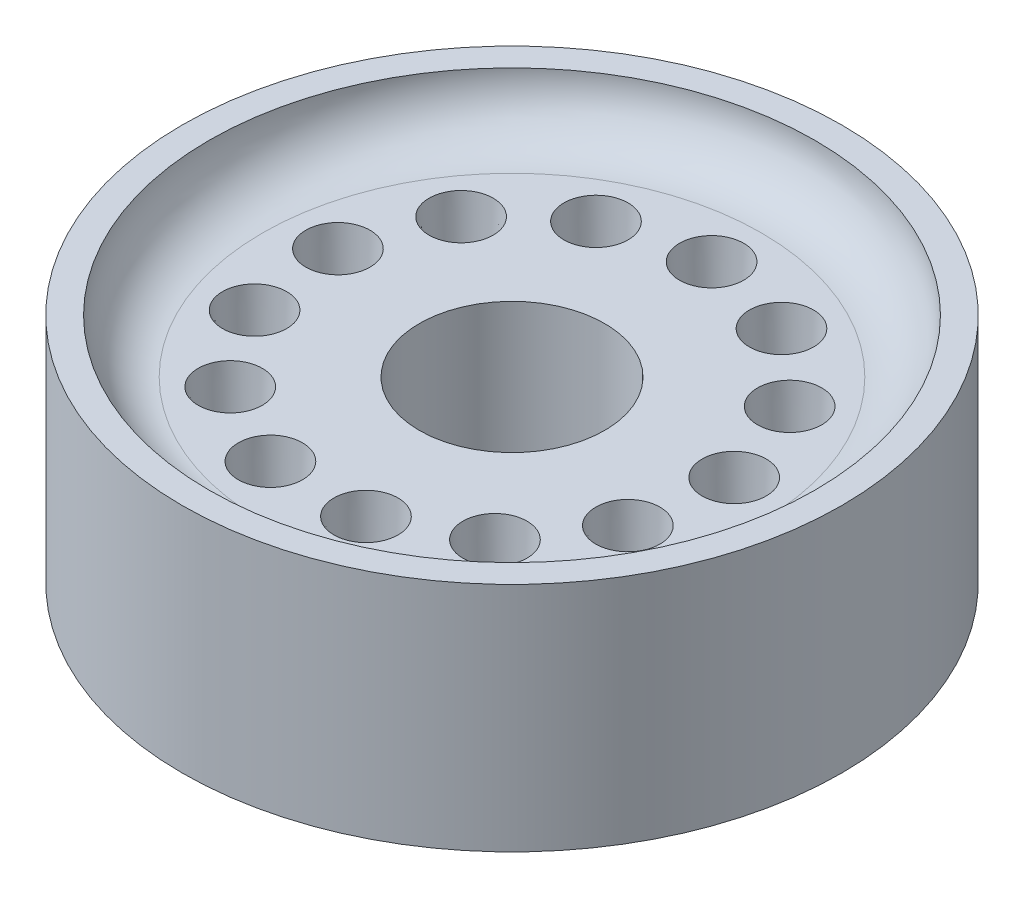
ISO-10303-21;
HEADER;
FILE_DESCRIPTION(('STEP AP214'),'2;1');
FILE_NAME('part.step','',(''),(''),'','','');
FILE_SCHEMA(('AUTOMOTIVE_DESIGN { 1 0 10303 214 1 1 1 1 }'));
ENDSEC;
DATA;
#1=APPLICATION_CONTEXT('core data for automotive mechanical design processes');
#2=APPLICATION_PROTOCOL_DEFINITION('international standard','automotive_design',2000,#1);
#3=PRODUCT_CONTEXT('',#1,'mechanical');
#4=PRODUCT('Part','Part','',(#3));
#5=PRODUCT_RELATED_PRODUCT_CATEGORY('part','',(#4));
#6=PRODUCT_DEFINITION_FORMATION('','',#4);
#7=PRODUCT_DEFINITION_CONTEXT('part definition',#1,'design');
#8=PRODUCT_DEFINITION('design','',#6,#7);
#9=PRODUCT_DEFINITION_SHAPE('','',#8);
#10=(LENGTH_UNIT() NAMED_UNIT(*) SI_UNIT(.MILLI.,.METRE.));
#11=(NAMED_UNIT(*) PLANE_ANGLE_UNIT() SI_UNIT($,.RADIAN.));
#12=(NAMED_UNIT(*) SI_UNIT($,.STERADIAN.) SOLID_ANGLE_UNIT());
#13=UNCERTAINTY_MEASURE_WITH_UNIT(LENGTH_MEASURE(1.E-05),#10,'distance_accuracy_value','');
#14=(GEOMETRIC_REPRESENTATION_CONTEXT(3) GLOBAL_UNCERTAINTY_ASSIGNED_CONTEXT((#13)) GLOBAL_UNIT_ASSIGNED_CONTEXT((#10,
#11,#12)) REPRESENTATION_CONTEXT('',''));
#15=CARTESIAN_POINT('',(0.,0.,0.));
#16=DIRECTION('',(0.,0.,1.));
#17=DIRECTION('',(1.,0.,0.));
#18=AXIS2_PLACEMENT_3D('',#15,#16,#17);
#19=CARTESIAN_POINT('',(0.,0.,0.));
#20=DIRECTION('',(0.,1.,0.));
#21=DIRECTION('',(0.,0.,1.));
#22=AXIS2_PLACEMENT_3D('',#19,#20,#21);
#23=CYLINDRICAL_SURFACE('',#22,2.6);
#24=CARTESIAN_POINT('',(0.,0.,0.));
#25=DIRECTION('',(0.,1.,0.));
#26=DIRECTION('',(0.,0.,1.));
#27=AXIS2_PLACEMENT_3D('',#24,#25,#26);
#28=CIRCLE('',#27,2.6);
#29=CARTESIAN_POINT('',(0.,0.,2.6));
#30=VERTEX_POINT('',#29);
#31=EDGE_CURVE('E48',#30,#30,#28,.T.);
#32=CARTESIAN_POINT('',(0.,5.,0.));
#33=DIRECTION('',(0.,1.,0.));
#34=DIRECTION('',(0.,0.,1.));
#35=AXIS2_PLACEMENT_3D('',#32,#33,#34);
#36=CIRCLE('',#35,2.6);
#37=CARTESIAN_POINT('',(0.,5.,2.6));
#38=VERTEX_POINT('',#37);
#39=EDGE_CURVE('E52',#38,#38,#36,.F.);
#40=CARTESIAN_POINT('',(0.,0.,2.6));
#41=CARTESIAN_POINT('',(0.,0.0520833333333332,2.6));
#42=CARTESIAN_POINT('',(0.,0.104166666666667,2.6));
#43=CARTESIAN_POINT('',(0.,0.208333333333333,2.6));
#44=CARTESIAN_POINT('',(0.,0.260416666666667,2.6));
#45=CARTESIAN_POINT('',(0.,0.364583333333333,2.6));
#46=CARTESIAN_POINT('',(0.,0.416666666666667,2.6));
#47=CARTESIAN_POINT('',(0.,0.520833333333333,2.6));
#48=CARTESIAN_POINT('',(0.,0.572916666666666,2.6));
#49=CARTESIAN_POINT('',(0.,0.677083333333333,2.6));
#50=CARTESIAN_POINT('',(0.,0.729166666666666,2.6));
#51=CARTESIAN_POINT('',(0.,0.833333333333333,2.6));
#52=CARTESIAN_POINT('',(0.,0.885416666666666,2.6));
#53=CARTESIAN_POINT('',(0.,0.989583333333333,2.6));
#54=CARTESIAN_POINT('',(0.,1.04166666666667,2.6));
#55=CARTESIAN_POINT('',(0.,1.14583333333333,2.6));
#56=CARTESIAN_POINT('',(0.,1.19791666666667,2.6));
#57=CARTESIAN_POINT('',(0.,1.30208333333333,2.6));
#58=CARTESIAN_POINT('',(0.,1.35416666666667,2.6));
#59=CARTESIAN_POINT('',(0.,1.45833333333333,2.6));
#60=CARTESIAN_POINT('',(0.,1.51041666666667,2.6));
#61=CARTESIAN_POINT('',(0.,1.61458333333333,2.6));
#62=CARTESIAN_POINT('',(0.,1.66666666666667,2.6));
#63=CARTESIAN_POINT('',(0.,1.77083333333333,2.6));
#64=CARTESIAN_POINT('',(0.,1.82291666666667,2.6));
#65=CARTESIAN_POINT('',(0.,1.92708333333333,2.6));
#66=CARTESIAN_POINT('',(0.,1.97916666666667,2.6));
#67=CARTESIAN_POINT('',(0.,2.08333333333333,2.6));
#68=CARTESIAN_POINT('',(0.,2.13541666666667,2.6));
#69=CARTESIAN_POINT('',(0.,2.23958333333333,2.6));
#70=CARTESIAN_POINT('',(0.,2.29166666666667,2.6));
#71=CARTESIAN_POINT('',(0.,2.39583333333333,2.6));
#72=CARTESIAN_POINT('',(0.,2.44791666666667,2.6));
#73=CARTESIAN_POINT('',(0.,2.55208333333333,2.6));
#74=CARTESIAN_POINT('',(0.,2.60416666666667,2.6));
#75=CARTESIAN_POINT('',(0.,2.70833333333333,2.6));
#76=CARTESIAN_POINT('',(0.,2.76041666666667,2.6));
#77=CARTESIAN_POINT('',(0.,2.86458333333333,2.6));
#78=CARTESIAN_POINT('',(0.,2.91666666666667,2.6));
#79=CARTESIAN_POINT('',(0.,3.02083333333333,2.6));
#80=CARTESIAN_POINT('',(0.,3.07291666666667,2.6));
#81=CARTESIAN_POINT('',(0.,3.17708333333333,2.6));
#82=CARTESIAN_POINT('',(0.,3.22916666666667,2.6));
#83=CARTESIAN_POINT('',(0.,3.33333333333333,2.6));
#84=CARTESIAN_POINT('',(0.,3.38541666666667,2.6));
#85=CARTESIAN_POINT('',(0.,3.48958333333333,2.6));
#86=CARTESIAN_POINT('',(0.,3.54166666666667,2.6));
#87=CARTESIAN_POINT('',(0.,3.64583333333333,2.6));
#88=CARTESIAN_POINT('',(0.,3.69791666666667,2.6));
#89=CARTESIAN_POINT('',(0.,3.80208333333333,2.6));
#90=CARTESIAN_POINT('',(0.,3.85416666666667,2.6));
#91=CARTESIAN_POINT('',(0.,3.95833333333333,2.6));
#92=CARTESIAN_POINT('',(0.,4.01041666666667,2.6));
#93=CARTESIAN_POINT('',(0.,4.11458333333333,2.6));
#94=CARTESIAN_POINT('',(0.,4.16666666666667,2.6));
#95=CARTESIAN_POINT('',(0.,4.27083333333333,2.6));
#96=CARTESIAN_POINT('',(0.,4.32291666666667,2.6));
#97=CARTESIAN_POINT('',(0.,4.42708333333333,2.6));
#98=CARTESIAN_POINT('',(0.,4.47916666666667,2.6));
#99=CARTESIAN_POINT('',(0.,4.58333333333333,2.6));
#100=CARTESIAN_POINT('',(0.,4.63541666666667,2.6));
#101=CARTESIAN_POINT('',(0.,4.73958333333333,2.6));
#102=CARTESIAN_POINT('',(0.,4.79166666666666,2.6));
#103=CARTESIAN_POINT('',(0.,4.89583333333333,2.6));
#104=CARTESIAN_POINT('',(0.,4.94791666666666,2.6));
#105=CARTESIAN_POINT('',(0.,5.,2.6));
#106=B_SPLINE_CURVE_WITH_KNOTS('',3,(#40,#41,#42,#43,#44,#45,#46,#47,#48,#49,#50,#51,#52,#53,
#54,#55,#56,#57,#58,#59,#60,#61,#62,#63,#64,#65,#66,#67,#68,#69,#70,#71,#72,#73,#74,#75,#76,#77,
#78,#79,#80,#81,#82,#83,#84,#85,#86,#87,#88,#89,#90,#91,#92,#93,#94,#95,#96,#97,#98,#99,#100,
#101,#102,#103,#104,#105),.UNSPECIFIED.,.F.,.F.,(4,2,2,2,2,2,2,2,2,2,2,2,2,2,2,2,2,2,2,2,2,2,2,
2,2,2,2,2,2,2,2,2,4),(0.,0.15625,0.3125,0.46875,0.625,0.78125,0.9375,1.09375,1.25,1.40625,
1.5625,1.71875,1.875,2.03125,2.1875,2.34375,2.5,2.65625,2.8125,2.96875,3.125,3.28125,3.4375,
3.59375,3.75,3.90625,4.0625,4.21875,4.375,4.53125,4.6875,4.84375,5.),.UNSPECIFIED.);
#107=EDGE_CURVE('BSEAM32',#30,#38,#106,.T.);
#108=ORIENTED_EDGE('',*,*,#31,.F.);
#109=ORIENTED_EDGE('',*,*,#39,.F.);
#110=ORIENTED_EDGE('',*,*,#107,.T.);
#111=ORIENTED_EDGE('',*,*,#107,.F.);
#112=EDGE_LOOP('',(#108,#110,#109,#111));
#113=FACE_BOUND('',#112,.T.);
#114=ADVANCED_FACE('F32',(#113),#23,.F.);
#115=CARTESIAN_POINT('',(0.,6.5,0.));
#116=DIRECTION('',(0.,-1.,0.));
#117=DIRECTION('',(0.,0.,-1.));
#118=AXIS2_PLACEMENT_3D('',#115,#116,#117);
#119=CYLINDRICAL_SURFACE('',#118,9.25);
#120=CARTESIAN_POINT('',(0.,0.,0.));
#121=DIRECTION('',(0.,1.,0.));
#122=DIRECTION('',(0.,0.,1.));
#123=AXIS2_PLACEMENT_3D('',#120,#121,#122);
#124=CIRCLE('',#123,9.25);
#125=CARTESIAN_POINT('',(0.,0.,-9.25));
#126=VERTEX_POINT('',#125);
#127=EDGE_CURVE('E43',#126,#126,#124,.T.);
#128=CARTESIAN_POINT('',(0.,6.5,0.));
#129=DIRECTION('',(0.,-1.,0.));
#130=DIRECTION('',(0.,0.,-1.));
#131=AXIS2_PLACEMENT_3D('',#128,#129,#130);
#132=CIRCLE('',#131,9.25);
#133=CARTESIAN_POINT('',(0.,6.5,-9.25));
#134=VERTEX_POINT('',#133);
#135=EDGE_CURVE('E39',#134,#134,#132,.T.);
#136=CARTESIAN_POINT('',(0.,0.,-9.25));
#137=CARTESIAN_POINT('',(0.,0.0677083333333333,-9.25));
#138=CARTESIAN_POINT('',(0.,0.135416666666667,-9.25));
#139=CARTESIAN_POINT('',(0.,0.270833333333334,-9.25));
#140=CARTESIAN_POINT('',(0.,0.338541666666667,-9.25));
#141=CARTESIAN_POINT('',(0.,0.473958333333334,-9.25));
#142=CARTESIAN_POINT('',(0.,0.541666666666667,-9.25));
#143=CARTESIAN_POINT('',(0.,0.677083333333334,-9.25));
#144=CARTESIAN_POINT('',(0.,0.744791666666667,-9.25));
#145=CARTESIAN_POINT('',(0.,0.880208333333333,-9.25));
#146=CARTESIAN_POINT('',(0.,0.947916666666667,-9.25));
#147=CARTESIAN_POINT('',(0.,1.08333333333333,-9.25));
#148=CARTESIAN_POINT('',(0.,1.15104166666667,-9.25));
#149=CARTESIAN_POINT('',(0.,1.28645833333333,-9.25));
#150=CARTESIAN_POINT('',(0.,1.35416666666667,-9.25));
#151=CARTESIAN_POINT('',(0.,1.48958333333333,-9.25));
#152=CARTESIAN_POINT('',(0.,1.55729166666667,-9.25));
#153=CARTESIAN_POINT('',(0.,1.69270833333333,-9.25));
#154=CARTESIAN_POINT('',(0.,1.76041666666667,-9.25));
#155=CARTESIAN_POINT('',(0.,1.89583333333333,-9.25));
#156=CARTESIAN_POINT('',(0.,1.96354166666667,-9.25));
#157=CARTESIAN_POINT('',(0.,2.09895833333333,-9.25));
#158=CARTESIAN_POINT('',(0.,2.16666666666667,-9.25));
#159=CARTESIAN_POINT('',(0.,2.30208333333333,-9.25));
#160=CARTESIAN_POINT('',(0.,2.36979166666667,-9.25));
#161=CARTESIAN_POINT('',(0.,2.50520833333333,-9.25));
#162=CARTESIAN_POINT('',(0.,2.57291666666667,-9.25));
#163=CARTESIAN_POINT('',(0.,2.70833333333333,-9.25));
#164=CARTESIAN_POINT('',(0.,2.77604166666667,-9.25));
#165=CARTESIAN_POINT('',(0.,2.91145833333333,-9.25));
#166=CARTESIAN_POINT('',(0.,2.97916666666667,-9.25));
#167=CARTESIAN_POINT('',(0.,3.11458333333333,-9.25));
#168=CARTESIAN_POINT('',(0.,3.18229166666667,-9.25));
#169=CARTESIAN_POINT('',(0.,3.31770833333333,-9.25));
#170=CARTESIAN_POINT('',(0.,3.38541666666667,-9.25));
#171=CARTESIAN_POINT('',(0.,3.52083333333333,-9.25));
#172=CARTESIAN_POINT('',(0.,3.58854166666667,-9.25));
#173=CARTESIAN_POINT('',(0.,3.72395833333333,-9.25));
#174=CARTESIAN_POINT('',(0.,3.79166666666667,-9.25));
#175=CARTESIAN_POINT('',(0.,3.92708333333333,-9.25));
#176=CARTESIAN_POINT('',(0.,3.99479166666667,-9.25));
#177=CARTESIAN_POINT('',(0.,4.13020833333333,-9.25));
#178=CARTESIAN_POINT('',(0.,4.19791666666667,-9.25));
#179=CARTESIAN_POINT('',(0.,4.33333333333333,-9.25));
#180=CARTESIAN_POINT('',(0.,4.40104166666667,-9.25));
#181=CARTESIAN_POINT('',(0.,4.53645833333333,-9.25));
#182=CARTESIAN_POINT('',(0.,4.60416666666667,-9.25));
#183=CARTESIAN_POINT('',(0.,4.73958333333333,-9.25));
#184=CARTESIAN_POINT('',(0.,4.80729166666667,-9.25));
#185=CARTESIAN_POINT('',(0.,4.94270833333333,-9.25));
#186=CARTESIAN_POINT('',(0.,5.01041666666667,-9.25));
#187=CARTESIAN_POINT('',(0.,5.14583333333333,-9.25));
#188=CARTESIAN_POINT('',(0.,5.21354166666667,-9.25));
#189=CARTESIAN_POINT('',(0.,5.34895833333333,-9.25));
#190=CARTESIAN_POINT('',(0.,5.41666666666667,-9.25));
#191=CARTESIAN_POINT('',(0.,5.55208333333333,-9.25));
#192=CARTESIAN_POINT('',(0.,5.61979166666667,-9.25));
#193=CARTESIAN_POINT('',(0.,5.75520833333333,-9.25));
#194=CARTESIAN_POINT('',(0.,5.82291666666667,-9.25));
#195=CARTESIAN_POINT('',(0.,5.95833333333333,-9.25));
#196=CARTESIAN_POINT('',(0.,6.02604166666667,-9.25));
#197=CARTESIAN_POINT('',(0.,6.16145833333333,-9.25));
#198=CARTESIAN_POINT('',(0.,6.22916666666667,-9.25));
#199=CARTESIAN_POINT('',(0.,6.36458333333333,-9.25));
#200=CARTESIAN_POINT('',(0.,6.43229166666667,-9.25));
#201=CARTESIAN_POINT('',(0.,6.5,-9.25));
#202=B_SPLINE_CURVE_WITH_KNOTS('',3,(#136,#137,#138,#139,#140,#141,#142,#143,#144,#145,#146,
#147,#148,#149,#150,#151,#152,#153,#154,#155,#156,#157,#158,#159,#160,#161,#162,#163,#164,#165,
#166,#167,#168,#169,#170,#171,#172,#173,#174,#175,#176,#177,#178,#179,#180,#181,#182,#183,#184,
#185,#186,#187,#188,#189,#190,#191,#192,#193,#194,#195,#196,#197,#198,#199,#200,#201),
.UNSPECIFIED.,.F.,.F.,(4,2,2,2,2,2,2,2,2,2,2,2,2,2,2,2,2,2,2,2,2,2,2,2,2,2,2,2,2,2,2,2,4),(0.,
0.203125,0.40625,0.609375000000001,0.8125,1.015625,1.21875,1.421875,1.625,1.828125,2.03125,
2.234375,2.4375,2.640625,2.84375,3.046875,3.25,3.453125,3.65625,3.859375,4.0625,4.265625,
4.46875,4.671875,4.875,5.078125,5.28125,5.484375,5.6875,5.890625,6.09375,6.296875,6.5),.UNSPECIFIED.);
#203=EDGE_CURVE('BSEAM172',#126,#134,#202,.T.);
#204=ORIENTED_EDGE('',*,*,#127,.T.);
#205=ORIENTED_EDGE('',*,*,#135,.T.);
#206=ORIENTED_EDGE('',*,*,#203,.T.);
#207=ORIENTED_EDGE('',*,*,#203,.F.);
#208=EDGE_LOOP('',(#204,#206,#205,#207));
#209=FACE_BOUND('',#208,.T.);
#210=ADVANCED_FACE('F172',(#209),#119,.T.);
#211=CARTESIAN_POINT('',(0.,6.5,0.));
#212=DIRECTION('',(0.,-1.,0.));
#213=DIRECTION('',(0.,0.,-1.));
#214=AXIS2_PLACEMENT_3D('',#211,#212,#213);
#215=PLANE('',#214);
#216=CARTESIAN_POINT('',(0.,6.5,0.));
#217=DIRECTION('',(0.,1.,0.));
#218=DIRECTION('',(0.,0.,1.));
#219=AXIS2_PLACEMENT_3D('',#216,#217,#218);
#220=CIRCLE('',#219,8.5);
#221=CARTESIAN_POINT('',(0.,6.5,8.5));
#222=VERTEX_POINT('',#221);
#223=EDGE_CURVE('E54',#222,#222,#220,.T.);
#224=ORIENTED_EDGE('',*,*,#223,.F.);
#225=EDGE_LOOP('',(#224));
#226=FACE_BOUND('',#225,.T.);
#227=ORIENTED_EDGE('',*,*,#135,.F.);
#228=EDGE_LOOP('',(#227));
#229=FACE_BOUND('',#228,.T.);
#230=ADVANCED_FACE('F178',(#226,#229),#215,.F.);
#231=CARTESIAN_POINT('',(0.,0.,0.));
#232=DIRECTION('',(0.,-1.,0.));
#233=DIRECTION('',(0.,0.,-1.));
#234=AXIS2_PLACEMENT_3D('',#231,#232,#233);
#235=PLANE('',#234);
#236=CARTESIAN_POINT('',(2.6024497634451,0.,-4.95855374365798));
#237=DIRECTION('',(0.,1.,0.));
#238=DIRECTION('',(0.,0.,1.));
#239=AXIS2_PLACEMENT_3D('',#236,#237,#238);
#240=CIRCLE('',#239,0.550365940282447);
#241=CARTESIAN_POINT('',(2.6024497634451,0.,-4.40818780337553));
#242=VERTEX_POINT('',#241);
#243=EDGE_CURVE('E68',#242,#242,#240,.T.);
#244=ORIENTED_EDGE('',*,*,#243,.T.);
#245=EDGE_LOOP('',(#244));
#246=FACE_BOUND('',#245,.T.);
#247=CARTESIAN_POINT('',(4.60870964900448,0.,-3.18116258169447));
#248=DIRECTION('',(0.,1.,0.));
#249=DIRECTION('',(0.,0.,1.));
#250=AXIS2_PLACEMENT_3D('',#247,#248,#249);
#251=CIRCLE('',#250,0.550365940282447);
#252=CARTESIAN_POINT('',(4.60870964900448,0.,-2.63079664141203));
#253=VERTEX_POINT('',#252);
#254=EDGE_CURVE('E107',#253,#253,#251,.T.);
#255=ORIENTED_EDGE('',*,*,#254,.T.);
#256=EDGE_LOOP('',(#255));
#257=FACE_BOUND('',#256,.T.);
#258=CARTESIAN_POINT('',(5.5591696949491,0.,-0.67500540942981));
#259=DIRECTION('',(0.,1.,0.));
#260=DIRECTION('',(0.,0.,1.));
#261=AXIS2_PLACEMENT_3D('',#258,#259,#260);
#262=CIRCLE('',#261,0.550365940282447);
#263=CARTESIAN_POINT('',(5.5591696949491,0.,-0.124639469147363));
#264=VERTEX_POINT('',#263);
#265=EDGE_CURVE('E101',#264,#264,#262,.T.);
#266=ORIENTED_EDGE('',*,*,#265,.T.);
#267=EDGE_LOOP('',(#266));
#268=FACE_BOUND('',#267,.T.);
#269=CARTESIAN_POINT('',(5.23609095903832,0.,1.9857873674382));
#270=DIRECTION('',(0.,1.,0.));
#271=DIRECTION('',(0.,0.,1.));
#272=AXIS2_PLACEMENT_3D('',#269,#270,#271);
#273=CIRCLE('',#272,0.550365940282447);
#274=CARTESIAN_POINT('',(5.23609095903832,0.,2.53615330772065));
#275=VERTEX_POINT('',#274);
#276=EDGE_CURVE('E95',#275,#275,#273,.T.);
#277=ORIENTED_EDGE('',*,*,#276,.T.);
#278=EDGE_LOOP('',(#277));
#279=FACE_BOUND('',#278,.T.);
#280=CARTESIAN_POINT('',(3.71348688614845,0.,4.19166018975817));
#281=DIRECTION('',(0.,1.,0.));
#282=DIRECTION('',(0.,0.,1.));
#283=AXIS2_PLACEMENT_3D('',#280,#281,#282);
#284=CIRCLE('',#283,0.550365940282446);
#285=CARTESIAN_POINT('',(3.71348688614845,0.,4.74202613004061));
#286=VERTEX_POINT('',#285);
#287=EDGE_CURVE('E89',#286,#286,#284,.T.);
#288=ORIENTED_EDGE('',*,*,#287,.T.);
#289=EDGE_LOOP('',(#288));
#290=FACE_BOUND('',#289,.T.);
#291=CARTESIAN_POINT('',(1.34016772001033,0.,5.43727417758589));
#292=DIRECTION('',(0.,1.,0.));
#293=DIRECTION('',(0.,0.,1.));
#294=AXIS2_PLACEMENT_3D('',#291,#292,#293);
#295=CIRCLE('',#294,0.550365940282447);
#296=CARTESIAN_POINT('',(1.34016772001033,0.,5.98764011786834));
#297=VERTEX_POINT('',#296);
#298=EDGE_CURVE('E83',#297,#297,#295,.T.);
#299=ORIENTED_EDGE('',*,*,#298,.T.);
#300=EDGE_LOOP('',(#299));
#301=FACE_BOUND('',#300,.T.);
#302=CARTESIAN_POINT('',(-1.34016772001032,0.,5.43727417758589));
#303=DIRECTION('',(0.,1.,0.));
#304=DIRECTION('',(0.,0.,1.));
#305=AXIS2_PLACEMENT_3D('',#302,#303,#304);
#306=CIRCLE('',#305,0.550365940282447);
#307=CARTESIAN_POINT('',(-1.34016772001032,0.,5.98764011786834));
#308=VERTEX_POINT('',#307);
#309=EDGE_CURVE('E77',#308,#308,#306,.T.);
#310=ORIENTED_EDGE('',*,*,#309,.T.);
#311=EDGE_LOOP('',(#310));
#312=FACE_BOUND('',#311,.T.);
#313=CARTESIAN_POINT('',(-3.71348688614845,0.,4.19166018975817));
#314=DIRECTION('',(0.,1.,0.));
#315=DIRECTION('',(0.,0.,1.));
#316=AXIS2_PLACEMENT_3D('',#313,#314,#315);
#317=CIRCLE('',#316,0.550365940282447);
#318=CARTESIAN_POINT('',(-3.71348688614845,0.,4.74202613004061));
#319=VERTEX_POINT('',#318);
#320=EDGE_CURVE('E69',#319,#319,#317,.T.);
#321=ORIENTED_EDGE('',*,*,#320,.T.);
#322=EDGE_LOOP('',(#321));
#323=FACE_BOUND('',#322,.T.);
#324=CARTESIAN_POINT('',(-5.23609095903832,0.,1.9857873674382));
#325=DIRECTION('',(0.,1.,0.));
#326=DIRECTION('',(0.,0.,1.));
#327=AXIS2_PLACEMENT_3D('',#324,#325,#326);
#328=CIRCLE('',#327,0.550365940282447);
#329=CARTESIAN_POINT('',(-5.23609095903832,0.,2.53615330772065));
#330=VERTEX_POINT('',#329);
#331=EDGE_CURVE('E76',#330,#330,#328,.T.);
#332=ORIENTED_EDGE('',*,*,#331,.T.);
#333=EDGE_LOOP('',(#332));
#334=FACE_BOUND('',#333,.T.);
#335=CARTESIAN_POINT('',(-5.5591696949491,0.,-0.675005409429805));
#336=DIRECTION('',(0.,1.,0.));
#337=DIRECTION('',(0.,0.,1.));
#338=AXIS2_PLACEMENT_3D('',#335,#336,#337);
#339=CIRCLE('',#338,0.550365940282447);
#340=CARTESIAN_POINT('',(-5.5591696949491,0.,-0.124639469147359));
#341=VERTEX_POINT('',#340);
#342=EDGE_CURVE('E130',#341,#341,#339,.T.);
#343=ORIENTED_EDGE('',*,*,#342,.T.);
#344=EDGE_LOOP('',(#343));
#345=FACE_BOUND('',#344,.T.);
#346=CARTESIAN_POINT('',(-4.60870964900448,0.,-3.18116258169447));
#347=DIRECTION('',(0.,1.,0.));
#348=DIRECTION('',(0.,0.,1.));
#349=AXIS2_PLACEMENT_3D('',#346,#347,#348);
#350=CIRCLE('',#349,0.550365940282447);
#351=CARTESIAN_POINT('',(-4.60870964900448,0.,-2.63079664141202));
#352=VERTEX_POINT('',#351);
#353=EDGE_CURVE('E124',#352,#352,#350,.T.);
#354=ORIENTED_EDGE('',*,*,#353,.T.);
#355=EDGE_LOOP('',(#354));
#356=FACE_BOUND('',#355,.T.);
#357=CARTESIAN_POINT('',(-2.60244976344511,0.,-4.95855374365797));
#358=DIRECTION('',(0.,1.,0.));
#359=DIRECTION('',(0.,0.,1.));
#360=AXIS2_PLACEMENT_3D('',#357,#358,#359);
#361=CIRCLE('',#360,0.550365940282447);
#362=CARTESIAN_POINT('',(-2.60244976344511,0.,-4.40818780337553));
#363=VERTEX_POINT('',#362);
#364=EDGE_CURVE('E117',#363,#363,#361,.T.);
#365=ORIENTED_EDGE('',*,*,#364,.T.);
#366=EDGE_LOOP('',(#365));
#367=FACE_BOUND('',#366,.T.);
#368=CARTESIAN_POINT('',(0.,0.,-5.6));
#369=DIRECTION('',(0.,1.,0.));
#370=DIRECTION('',(0.,0.,1.));
#371=AXIS2_PLACEMENT_3D('',#368,#369,#370);
#372=CIRCLE('',#371,0.550365940282447);
#373=CARTESIAN_POINT('',(0.,0.,-5.04963405971755));
#374=VERTEX_POINT('',#373);
#375=EDGE_CURVE('E59',#374,#374,#372,.T.);
#376=ORIENTED_EDGE('',*,*,#375,.T.);
#377=EDGE_LOOP('',(#376));
#378=FACE_BOUND('',#377,.T.);
#379=ORIENTED_EDGE('',*,*,#31,.T.);
#380=EDGE_LOOP('',(#379));
#381=FACE_BOUND('',#380,.T.);
#382=ORIENTED_EDGE('',*,*,#127,.F.);
#383=EDGE_LOOP('',(#382));
#384=FACE_BOUND('',#383,.T.);
#385=ADVANCED_FACE('F146',(#246,#257,#268,#279,#290,#301,#312,#323,#334,#345,#356,#367,#378,
#381,#384),#235,.T.);
#386=CARTESIAN_POINT('',(0.,5.,0.));
#387=DIRECTION('',(0.,1.,0.));
#388=DIRECTION('',(0.,0.,1.));
#389=AXIS2_PLACEMENT_3D('',#386,#387,#388);
#390=PLANE('',#389);
#391=CARTESIAN_POINT('',(2.6024497634451,5.,-4.95855374365798));
#392=DIRECTION('',(0.,1.,0.));
#393=DIRECTION('',(0.,0.,1.));
#394=AXIS2_PLACEMENT_3D('',#391,#392,#393);
#395=CIRCLE('',#394,0.9);
#396=CARTESIAN_POINT('',(2.6024497634451,5.,-4.05855374365798));
#397=VERTEX_POINT('',#396);
#398=EDGE_CURVE('E110',#397,#397,#395,.T.);
#399=ORIENTED_EDGE('',*,*,#398,.F.);
#400=EDGE_LOOP('',(#399));
#401=FACE_BOUND('',#400,.T.);
#402=CARTESIAN_POINT('',(4.60870964900448,5.,-3.18116258169447));
#403=DIRECTION('',(0.,1.,0.));
#404=DIRECTION('',(0.,0.,1.));
#405=AXIS2_PLACEMENT_3D('',#402,#403,#404);
#406=CIRCLE('',#405,0.9);
#407=CARTESIAN_POINT('',(4.60870964900448,5.,-2.28116258169447));
#408=VERTEX_POINT('',#407);
#409=EDGE_CURVE('E104',#408,#408,#406,.T.);
#410=ORIENTED_EDGE('',*,*,#409,.F.);
#411=EDGE_LOOP('',(#410));
#412=FACE_BOUND('',#411,.T.);
#413=CARTESIAN_POINT('',(5.5591696949491,5.,-0.67500540942981));
#414=DIRECTION('',(0.,1.,0.));
#415=DIRECTION('',(0.,0.,1.));
#416=AXIS2_PLACEMENT_3D('',#413,#414,#415);
#417=CIRCLE('',#416,0.899999999999999);
#418=CARTESIAN_POINT('',(5.5591696949491,5.,0.22499459057019));
#419=VERTEX_POINT('',#418);
#420=EDGE_CURVE('E98',#419,#419,#417,.T.);
#421=ORIENTED_EDGE('',*,*,#420,.F.);
#422=EDGE_LOOP('',(#421));
#423=FACE_BOUND('',#422,.T.);
#424=CARTESIAN_POINT('',(5.23609095903832,5.,1.9857873674382));
#425=DIRECTION('',(0.,1.,0.));
#426=DIRECTION('',(0.,0.,1.));
#427=AXIS2_PLACEMENT_3D('',#424,#425,#426);
#428=CIRCLE('',#427,0.899999999999999);
#429=CARTESIAN_POINT('',(5.23609095903832,5.,2.8857873674382));
#430=VERTEX_POINT('',#429);
#431=EDGE_CURVE('E92',#430,#430,#428,.T.);
#432=ORIENTED_EDGE('',*,*,#431,.F.);
#433=EDGE_LOOP('',(#432));
#434=FACE_BOUND('',#433,.T.);
#435=CARTESIAN_POINT('',(3.71348688614845,5.,4.19166018975817));
#436=DIRECTION('',(0.,1.,0.));
#437=DIRECTION('',(0.,0.,1.));
#438=AXIS2_PLACEMENT_3D('',#435,#436,#437);
#439=CIRCLE('',#438,0.899999999999999);
#440=CARTESIAN_POINT('',(3.71348688614845,5.,5.09166018975816));
#441=VERTEX_POINT('',#440);
#442=EDGE_CURVE('E86',#441,#441,#439,.T.);
#443=ORIENTED_EDGE('',*,*,#442,.F.);
#444=EDGE_LOOP('',(#443));
#445=FACE_BOUND('',#444,.T.);
#446=CARTESIAN_POINT('',(1.34016772001033,5.,5.43727417758589));
#447=DIRECTION('',(0.,1.,0.));
#448=DIRECTION('',(0.,0.,1.));
#449=AXIS2_PLACEMENT_3D('',#446,#447,#448);
#450=CIRCLE('',#449,0.899999999999999);
#451=CARTESIAN_POINT('',(1.34016772001033,5.,6.33727417758589));
#452=VERTEX_POINT('',#451);
#453=EDGE_CURVE('E80',#452,#452,#450,.T.);
#454=ORIENTED_EDGE('',*,*,#453,.F.);
#455=EDGE_LOOP('',(#454));
#456=FACE_BOUND('',#455,.T.);
#457=CARTESIAN_POINT('',(-1.34016772001032,5.,5.43727417758589));
#458=DIRECTION('',(0.,1.,0.));
#459=DIRECTION('',(0.,0.,1.));
#460=AXIS2_PLACEMENT_3D('',#457,#458,#459);
#461=CIRCLE('',#460,0.899999999999999);
#462=CARTESIAN_POINT('',(-1.34016772001032,5.,6.33727417758589));
#463=VERTEX_POINT('',#462);
#464=EDGE_CURVE('E72',#463,#463,#461,.T.);
#465=ORIENTED_EDGE('',*,*,#464,.F.);
#466=EDGE_LOOP('',(#465));
#467=FACE_BOUND('',#466,.T.);
#468=CARTESIAN_POINT('',(-3.71348688614845,5.,4.19166018975817));
#469=DIRECTION('',(0.,1.,0.));
#470=DIRECTION('',(0.,0.,1.));
#471=AXIS2_PLACEMENT_3D('',#468,#469,#470);
#472=CIRCLE('',#471,0.9);
#473=CARTESIAN_POINT('',(-3.71348688614845,5.,5.09166018975817));
#474=VERTEX_POINT('',#473);
#475=EDGE_CURVE('E73',#474,#474,#472,.T.);
#476=ORIENTED_EDGE('',*,*,#475,.F.);
#477=EDGE_LOOP('',(#476));
#478=FACE_BOUND('',#477,.T.);
#479=CARTESIAN_POINT('',(-5.23609095903832,5.,1.9857873674382));
#480=DIRECTION('',(0.,1.,0.));
#481=DIRECTION('',(0.,0.,1.));
#482=AXIS2_PLACEMENT_3D('',#479,#480,#481);
#483=CIRCLE('',#482,0.899999999999999);
#484=CARTESIAN_POINT('',(-5.23609095903832,5.,2.8857873674382));
#485=VERTEX_POINT('',#484);
#486=EDGE_CURVE('E133',#485,#485,#483,.T.);
#487=ORIENTED_EDGE('',*,*,#486,.F.);
#488=EDGE_LOOP('',(#487));
#489=FACE_BOUND('',#488,.T.);
#490=CARTESIAN_POINT('',(-5.5591696949491,5.,-0.675005409429805));
#491=DIRECTION('',(0.,1.,0.));
#492=DIRECTION('',(0.,0.,1.));
#493=AXIS2_PLACEMENT_3D('',#490,#491,#492);
#494=CIRCLE('',#493,0.899999999999999);
#495=CARTESIAN_POINT('',(-5.5591696949491,5.,0.224994590570194));
#496=VERTEX_POINT('',#495);
#497=EDGE_CURVE('E127',#496,#496,#494,.T.);
#498=ORIENTED_EDGE('',*,*,#497,.F.);
#499=EDGE_LOOP('',(#498));
#500=FACE_BOUND('',#499,.T.);
#501=CARTESIAN_POINT('',(-4.60870964900448,5.,-3.18116258169447));
#502=DIRECTION('',(0.,1.,0.));
#503=DIRECTION('',(0.,0.,1.));
#504=AXIS2_PLACEMENT_3D('',#501,#502,#503);
#505=CIRCLE('',#504,0.9);
#506=CARTESIAN_POINT('',(-4.60870964900448,5.,-2.28116258169447));
#507=VERTEX_POINT('',#506);
#508=EDGE_CURVE('E120',#507,#507,#505,.T.);
#509=ORIENTED_EDGE('',*,*,#508,.F.);
#510=EDGE_LOOP('',(#509));
#511=FACE_BOUND('',#510,.T.);
#512=CARTESIAN_POINT('',(-2.60244976344511,5.,-4.95855374365797));
#513=DIRECTION('',(0.,1.,0.));
#514=DIRECTION('',(0.,0.,1.));
#515=AXIS2_PLACEMENT_3D('',#512,#513,#514);
#516=CIRCLE('',#515,0.899999999999999);
#517=CARTESIAN_POINT('',(-2.60244976344511,5.,-4.05855374365797));
#518=VERTEX_POINT('',#517);
#519=EDGE_CURVE('E121',#518,#518,#516,.T.);
#520=ORIENTED_EDGE('',*,*,#519,.F.);
#521=EDGE_LOOP('',(#520));
#522=FACE_BOUND('',#521,.T.);
#523=CARTESIAN_POINT('',(0.,5.,-5.6));
#524=DIRECTION('',(0.,1.,0.));
#525=DIRECTION('',(0.,0.,1.));
#526=AXIS2_PLACEMENT_3D('',#523,#524,#525);
#527=CIRCLE('',#526,0.899999999999999);
#528=CARTESIAN_POINT('',(0.,5.,-4.7));
#529=VERTEX_POINT('',#528);
#530=EDGE_CURVE('E63',#529,#529,#527,.T.);
#531=ORIENTED_EDGE('',*,*,#530,.F.);
#532=EDGE_LOOP('',(#531));
#533=FACE_BOUND('',#532,.T.);
#534=CARTESIAN_POINT('',(0.,5.,0.));
#535=DIRECTION('',(0.,1.,0.));
#536=DIRECTION('',(0.,0.,1.));
#537=AXIS2_PLACEMENT_3D('',#534,#535,#536);
#538=CIRCLE('',#537,7.);
#539=CARTESIAN_POINT('',(0.,5.,7.));
#540=VERTEX_POINT('',#539);
#541=EDGE_CURVE('E10',#540,#540,#538,.T.);
#542=ORIENTED_EDGE('',*,*,#541,.T.);
#543=EDGE_LOOP('',(#542));
#544=FACE_BOUND('',#543,.T.);
#545=ORIENTED_EDGE('',*,*,#39,.T.);
#546=EDGE_LOOP('',(#545));
#547=FACE_BOUND('',#546,.T.);
#548=ADVANCED_FACE('F143',(#401,#412,#423,#434,#445,#456,#467,#478,#489,#500,#511,#522,#533,
#544,#547),#390,.T.);
#549=CARTESIAN_POINT('',(0.,6.5,0.));
#550=DIRECTION('',(0.,1.,0.));
#551=DIRECTION('',(0.,0.,1.));
#552=AXIS2_PLACEMENT_3D('',#549,#550,#551);
#553=TOROIDAL_SURFACE('',#552,7.,1.5);
#554=ORIENTED_EDGE('',*,*,#223,.T.);
#555=EDGE_LOOP('',(#554));
#556=FACE_BOUND('',#555,.T.);
#557=ORIENTED_EDGE('',*,*,#541,.F.);
#558=EDGE_LOOP('',(#557));
#559=FACE_BOUND('',#558,.T.);
#560=ADVANCED_FACE('F34',(#556,#559),#553,.F.);
#561=CARTESIAN_POINT('',(0.,5.,-5.6));
#562=DIRECTION('',(0.,1.,0.));
#563=DIRECTION('',(0.,0.,1.));
#564=AXIS2_PLACEMENT_3D('',#561,#562,#563);
#565=CONICAL_SURFACE('',#564,0.899999999999999,0.0698131700797733);
#566=ORIENTED_EDGE('',*,*,#375,.F.);
#567=EDGE_LOOP('',(#566));
#568=FACE_BOUND('',#567,.T.);
#569=ORIENTED_EDGE('',*,*,#530,.T.);
#570=EDGE_LOOP('',(#569));
#571=FACE_BOUND('',#570,.T.);
#572=ADVANCED_FACE('F157',(#568,#571),#565,.F.);
#573=CARTESIAN_POINT('',(-2.60244976344511,5.,-4.95855374365797));
#574=DIRECTION('',(0.,1.,0.));
#575=DIRECTION('',(0.,0.,1.));
#576=AXIS2_PLACEMENT_3D('',#573,#574,#575);
#577=CONICAL_SURFACE('',#576,0.899999999999999,0.0698131700797733);
#578=ORIENTED_EDGE('',*,*,#364,.F.);
#579=EDGE_LOOP('',(#578));
#580=FACE_BOUND('',#579,.T.);
#581=ORIENTED_EDGE('',*,*,#519,.T.);
#582=EDGE_LOOP('',(#581));
#583=FACE_BOUND('',#582,.T.);
#584=ADVANCED_FACE('F159',(#580,#583),#577,.F.);
#585=CARTESIAN_POINT('',(-4.60870964900448,5.,-3.18116258169447));
#586=DIRECTION('',(0.,1.,0.));
#587=DIRECTION('',(0.,0.,1.));
#588=AXIS2_PLACEMENT_3D('',#585,#586,#587);
#589=CONICAL_SURFACE('',#588,0.9,0.0698131700797733);
#590=ORIENTED_EDGE('',*,*,#353,.F.);
#591=EDGE_LOOP('',(#590));
#592=FACE_BOUND('',#591,.T.);
#593=ORIENTED_EDGE('',*,*,#508,.T.);
#594=EDGE_LOOP('',(#593));
#595=FACE_BOUND('',#594,.T.);
#596=ADVANCED_FACE('F166',(#592,#595),#589,.F.);
#597=CARTESIAN_POINT('',(-5.5591696949491,5.,-0.675005409429805));
#598=DIRECTION('',(0.,1.,0.));
#599=DIRECTION('',(0.,0.,1.));
#600=AXIS2_PLACEMENT_3D('',#597,#598,#599);
#601=CONICAL_SURFACE('',#600,0.899999999999999,0.0698131700797733);
#602=ORIENTED_EDGE('',*,*,#342,.F.);
#603=EDGE_LOOP('',(#602));
#604=FACE_BOUND('',#603,.T.);
#605=ORIENTED_EDGE('',*,*,#497,.T.);
#606=EDGE_LOOP('',(#605));
#607=FACE_BOUND('',#606,.T.);
#608=ADVANCED_FACE('F221',(#604,#607),#601,.F.);
#609=CARTESIAN_POINT('',(-5.23609095903832,5.,1.9857873674382));
#610=DIRECTION('',(0.,1.,0.));
#611=DIRECTION('',(0.,0.,1.));
#612=AXIS2_PLACEMENT_3D('',#609,#610,#611);
#613=CONICAL_SURFACE('',#612,0.899999999999999,0.0698131700797733);
#614=ORIENTED_EDGE('',*,*,#331,.F.);
#615=EDGE_LOOP('',(#614));
#616=FACE_BOUND('',#615,.T.);
#617=ORIENTED_EDGE('',*,*,#486,.T.);
#618=EDGE_LOOP('',(#617));
#619=FACE_BOUND('',#618,.T.);
#620=ADVANCED_FACE('F141',(#616,#619),#613,.F.);
#621=CARTESIAN_POINT('',(-3.71348688614845,5.,4.19166018975817));
#622=DIRECTION('',(0.,1.,0.));
#623=DIRECTION('',(0.,0.,1.));
#624=AXIS2_PLACEMENT_3D('',#621,#622,#623);
#625=CONICAL_SURFACE('',#624,0.9,0.0698131700797733);
#626=ORIENTED_EDGE('',*,*,#320,.F.);
#627=EDGE_LOOP('',(#626));
#628=FACE_BOUND('',#627,.T.);
#629=ORIENTED_EDGE('',*,*,#475,.T.);
#630=EDGE_LOOP('',(#629));
#631=FACE_BOUND('',#630,.T.);
#632=ADVANCED_FACE('F256',(#628,#631),#625,.F.);
#633=CARTESIAN_POINT('',(-1.34016772001032,5.,5.43727417758589));
#634=DIRECTION('',(0.,1.,0.));
#635=DIRECTION('',(0.,0.,1.));
#636=AXIS2_PLACEMENT_3D('',#633,#634,#635);
#637=CONICAL_SURFACE('',#636,0.899999999999999,0.0698131700797733);
#638=ORIENTED_EDGE('',*,*,#309,.F.);
#639=EDGE_LOOP('',(#638));
#640=FACE_BOUND('',#639,.T.);
#641=ORIENTED_EDGE('',*,*,#464,.T.);
#642=EDGE_LOOP('',(#641));
#643=FACE_BOUND('',#642,.T.);
#644=ADVANCED_FACE('F253',(#640,#643),#637,.F.);
#645=CARTESIAN_POINT('',(1.34016772001033,5.,5.43727417758589));
#646=DIRECTION('',(0.,1.,0.));
#647=DIRECTION('',(0.,0.,1.));
#648=AXIS2_PLACEMENT_3D('',#645,#646,#647);
#649=CONICAL_SURFACE('',#648,0.899999999999999,0.0698131700797733);
#650=ORIENTED_EDGE('',*,*,#298,.F.);
#651=EDGE_LOOP('',(#650));
#652=FACE_BOUND('',#651,.T.);
#653=ORIENTED_EDGE('',*,*,#453,.T.);
#654=EDGE_LOOP('',(#653));
#655=FACE_BOUND('',#654,.T.);
#656=ADVANCED_FACE('F249',(#652,#655),#649,.F.);
#657=CARTESIAN_POINT('',(3.71348688614845,5.,4.19166018975817));
#658=DIRECTION('',(0.,1.,0.));
#659=DIRECTION('',(0.,0.,1.));
#660=AXIS2_PLACEMENT_3D('',#657,#658,#659);
#661=CONICAL_SURFACE('',#660,0.899999999999999,0.0698131700797733);
#662=ORIENTED_EDGE('',*,*,#287,.F.);
#663=EDGE_LOOP('',(#662));
#664=FACE_BOUND('',#663,.T.);
#665=ORIENTED_EDGE('',*,*,#442,.T.);
#666=EDGE_LOOP('',(#665));
#667=FACE_BOUND('',#666,.T.);
#668=ADVANCED_FACE('F245',(#664,#667),#661,.F.);
#669=CARTESIAN_POINT('',(5.23609095903832,5.,1.9857873674382));
#670=DIRECTION('',(0.,1.,0.));
#671=DIRECTION('',(0.,0.,1.));
#672=AXIS2_PLACEMENT_3D('',#669,#670,#671);
#673=CONICAL_SURFACE('',#672,0.899999999999999,0.0698131700797733);
#674=ORIENTED_EDGE('',*,*,#276,.F.);
#675=EDGE_LOOP('',(#674));
#676=FACE_BOUND('',#675,.T.);
#677=ORIENTED_EDGE('',*,*,#431,.T.);
#678=EDGE_LOOP('',(#677));
#679=FACE_BOUND('',#678,.T.);
#680=ADVANCED_FACE('F241',(#676,#679),#673,.F.);
#681=CARTESIAN_POINT('',(5.5591696949491,5.,-0.67500540942981));
#682=DIRECTION('',(0.,1.,0.));
#683=DIRECTION('',(0.,0.,1.));
#684=AXIS2_PLACEMENT_3D('',#681,#682,#683);
#685=CONICAL_SURFACE('',#684,0.899999999999999,0.0698131700797733);
#686=ORIENTED_EDGE('',*,*,#265,.F.);
#687=EDGE_LOOP('',(#686));
#688=FACE_BOUND('',#687,.T.);
#689=ORIENTED_EDGE('',*,*,#420,.T.);
#690=EDGE_LOOP('',(#689));
#691=FACE_BOUND('',#690,.T.);
#692=ADVANCED_FACE('F237',(#688,#691),#685,.F.);
#693=CARTESIAN_POINT('',(4.60870964900448,5.,-3.18116258169447));
#694=DIRECTION('',(0.,1.,0.));
#695=DIRECTION('',(0.,0.,1.));
#696=AXIS2_PLACEMENT_3D('',#693,#694,#695);
#697=CONICAL_SURFACE('',#696,0.9,0.0698131700797733);
#698=ORIENTED_EDGE('',*,*,#254,.F.);
#699=EDGE_LOOP('',(#698));
#700=FACE_BOUND('',#699,.T.);
#701=ORIENTED_EDGE('',*,*,#409,.T.);
#702=EDGE_LOOP('',(#701));
#703=FACE_BOUND('',#702,.T.);
#704=ADVANCED_FACE('F233',(#700,#703),#697,.F.);
#705=CARTESIAN_POINT('',(2.6024497634451,5.,-4.95855374365798));
#706=DIRECTION('',(0.,1.,0.));
#707=DIRECTION('',(0.,0.,1.));
#708=AXIS2_PLACEMENT_3D('',#705,#706,#707);
#709=CONICAL_SURFACE('',#708,0.9,0.0698131700797733);
#710=ORIENTED_EDGE('',*,*,#243,.F.);
#711=EDGE_LOOP('',(#710));
#712=FACE_BOUND('',#711,.T.);
#713=ORIENTED_EDGE('',*,*,#398,.T.);
#714=EDGE_LOOP('',(#713));
#715=FACE_BOUND('',#714,.T.);
#716=ADVANCED_FACE('F230',(#712,#715),#709,.F.);
#717=CLOSED_SHELL('',(#114,#210,#230,#385,#548,#560,#572,#584,#596,#608,#620,#632,#644,#656,
#668,#680,#692,#704,#716));
#718=MANIFOLD_SOLID_BREP('B2',#717);
#719=ADVANCED_BREP_SHAPE_REPRESENTATION('',(#18,#718),#14);
#720=SHAPE_DEFINITION_REPRESENTATION(#9,#719);
ENDSEC;
END-ISO-10303-21;
